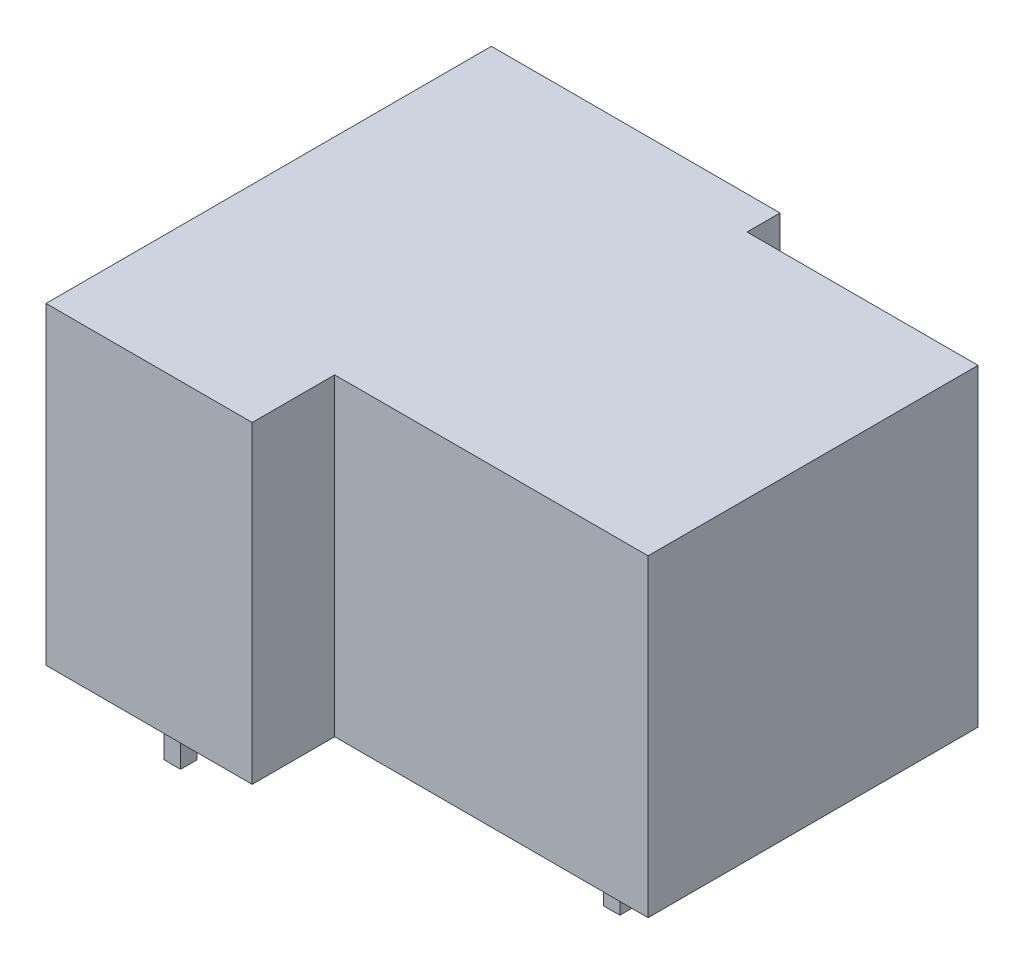
ISO-10303-21;
HEADER;
FILE_DESCRIPTION(('STEP AP214'),'2;1');
FILE_NAME('part.step','',(''),(''),'','','');
FILE_SCHEMA(('AUTOMOTIVE_DESIGN { 1 0 10303 214 1 1 1 1 }'));
ENDSEC;
DATA;
#1=APPLICATION_CONTEXT('core data for automotive mechanical design processes');
#2=APPLICATION_PROTOCOL_DEFINITION('international standard','automotive_design',2000,#1);
#3=PRODUCT_CONTEXT('',#1,'mechanical');
#4=PRODUCT('Part','Part','',(#3));
#5=PRODUCT_RELATED_PRODUCT_CATEGORY('part','',(#4));
#6=PRODUCT_DEFINITION_FORMATION('','',#4);
#7=PRODUCT_DEFINITION_CONTEXT('part definition',#1,'design');
#8=PRODUCT_DEFINITION('design','',#6,#7);
#9=PRODUCT_DEFINITION_SHAPE('','',#8);
#10=(LENGTH_UNIT() NAMED_UNIT(*) SI_UNIT(.MILLI.,.METRE.));
#11=(NAMED_UNIT(*) PLANE_ANGLE_UNIT() SI_UNIT($,.RADIAN.));
#12=(NAMED_UNIT(*) SI_UNIT($,.STERADIAN.) SOLID_ANGLE_UNIT());
#13=UNCERTAINTY_MEASURE_WITH_UNIT(LENGTH_MEASURE(1.E-05),#10,'distance_accuracy_value','');
#14=(GEOMETRIC_REPRESENTATION_CONTEXT(3) GLOBAL_UNCERTAINTY_ASSIGNED_CONTEXT((#13)) GLOBAL_UNIT_ASSIGNED_CONTEXT((#10,
#11,#12)) REPRESENTATION_CONTEXT('',''));
#15=CARTESIAN_POINT('',(0.,0.,0.));
#16=DIRECTION('',(0.,0.,1.));
#17=DIRECTION('',(1.,0.,0.));
#18=AXIS2_PLACEMENT_3D('',#15,#16,#17);
#19=CARTESIAN_POINT('',(5.,0.,-12.));
#20=DIRECTION('',(0.,1.,0.));
#21=DIRECTION('',(0.,0.,1.));
#22=AXIS2_PLACEMENT_3D('',#19,#20,#21);
#23=PLANE('',#22);
#24=DIRECTION('',(1.,0.,0.));
#25=VECTOR('',#24,1.);
#26=CARTESIAN_POINT('',(-0.789220796480683,0.,-9.77773978099936));
#27=LINE('',#26,#25);
#28=CARTESIAN_POINT('',(-1.78922079648068,0.,-9.77773978099936));
#29=VERTEX_POINT('',#28);
#30=CARTESIAN_POINT('',(-0.789220796480683,0.,-9.77773978099936));
#31=VERTEX_POINT('',#30);
#32=EDGE_CURVE('E241',#29,#31,#27,.T.);
#33=ORIENTED_EDGE('',*,*,#32,.F.);
#34=DIRECTION('',(0.,0.,-1.));
#35=VECTOR('',#34,1.);
#36=CARTESIAN_POINT('',(-1.78922079648068,0.,-9.77773978099936));
#37=LINE('',#36,#35);
#38=CARTESIAN_POINT('',(-1.78922079648068,0.,-8.77773978099936));
#39=VERTEX_POINT('',#38);
#40=EDGE_CURVE('E254',#39,#29,#37,.T.);
#41=ORIENTED_EDGE('',*,*,#40,.F.);
#42=DIRECTION('',(-1.,0.,0.));
#43=VECTOR('',#42,1.);
#44=CARTESIAN_POINT('',(-0.789220796480683,0.,-8.77773978099936));
#45=LINE('',#44,#43);
#46=CARTESIAN_POINT('',(-0.789220796480683,0.,-8.77773978099936));
#47=VERTEX_POINT('',#46);
#48=EDGE_CURVE('E263',#47,#39,#45,.T.);
#49=ORIENTED_EDGE('',*,*,#48,.F.);
#50=DIRECTION('',(0.,0.,1.));
#51=VECTOR('',#50,1.);
#52=CARTESIAN_POINT('',(-0.789220796480683,0.,-9.77773978099936));
#53=LINE('',#52,#51);
#54=EDGE_CURVE('E244',#31,#47,#53,.T.);
#55=ORIENTED_EDGE('',*,*,#54,.F.);
#56=EDGE_LOOP('',(#33,#41,#49,#55));
#57=FACE_BOUND('',#56,.T.);
#58=DIRECTION('',(0.,0.,1.));
#59=VECTOR('',#58,1.);
#60=CARTESIAN_POINT('',(14.5169439383121,0.,7.22643302070398));
#61=LINE('',#60,#59);
#62=CARTESIAN_POINT('',(14.5169439383121,0.,6.22643302070398));
#63=VERTEX_POINT('',#62);
#64=CARTESIAN_POINT('',(14.5169439383121,0.,7.22643302070398));
#65=VERTEX_POINT('',#64);
#66=EDGE_CURVE('E312',#63,#65,#61,.T.);
#67=ORIENTED_EDGE('',*,*,#66,.F.);
#68=DIRECTION('',(1.,0.,0.));
#69=VECTOR('',#68,1.);
#70=CARTESIAN_POINT('',(14.5169439383121,0.,6.22643302070398));
#71=LINE('',#70,#69);
#72=CARTESIAN_POINT('',(13.5169439383121,0.,6.22643302070398));
#73=VERTEX_POINT('',#72);
#74=EDGE_CURVE('E317',#73,#63,#71,.T.);
#75=ORIENTED_EDGE('',*,*,#74,.F.);
#76=DIRECTION('',(0.,0.,-1.));
#77=VECTOR('',#76,1.);
#78=CARTESIAN_POINT('',(13.5169439383121,0.,7.22643302070398));
#79=LINE('',#78,#77);
#80=CARTESIAN_POINT('',(13.5169439383121,0.,7.22643302070397));
#81=VERTEX_POINT('',#80);
#82=EDGE_CURVE('E329',#81,#73,#79,.T.);
#83=ORIENTED_EDGE('',*,*,#82,.F.);
#84=DIRECTION('',(-1.,0.,0.));
#85=VECTOR('',#84,1.);
#86=CARTESIAN_POINT('',(14.5169439383121,0.,7.22643302070398));
#87=LINE('',#86,#85);
#88=EDGE_CURVE('E326',#65,#81,#87,.T.);
#89=ORIENTED_EDGE('',*,*,#88,.F.);
#90=EDGE_LOOP('',(#67,#75,#83,#89));
#91=FACE_BOUND('',#90,.T.);
#92=DIRECTION('',(0.,0.,-1.));
#93=VECTOR('',#92,1.);
#94=CARTESIAN_POINT('',(5.,0.,-12.));
#95=LINE('',#94,#93);
#96=CARTESIAN_POINT('',(5.,0.,-10.));
#97=VERTEX_POINT('',#96);
#98=CARTESIAN_POINT('',(5.,0.,-12.));
#99=VERTEX_POINT('',#98);
#100=EDGE_CURVE('E378',#97,#99,#95,.T.);
#101=ORIENTED_EDGE('',*,*,#100,.F.);
#102=DIRECTION('',(-1.,0.,0.));
#103=VECTOR('',#102,1.);
#104=CARTESIAN_POINT('',(5.,0.,-10.));
#105=LINE('',#104,#103);
#106=CARTESIAN_POINT('',(19.,0.,-10.));
#107=VERTEX_POINT('',#106);
#108=EDGE_CURVE('E383',#107,#97,#105,.T.);
#109=ORIENTED_EDGE('',*,*,#108,.F.);
#110=DIRECTION('',(0.,0.,-1.));
#111=VECTOR('',#110,1.);
#112=CARTESIAN_POINT('',(19.,0.,-10.));
#113=LINE('',#112,#111);
#114=CARTESIAN_POINT('',(19.,0.,9.99999999999999));
#115=VERTEX_POINT('',#114);
#116=EDGE_CURVE('E410',#115,#107,#113,.T.);
#117=ORIENTED_EDGE('',*,*,#116,.F.);
#118=DIRECTION('',(1.,0.,0.));
#119=VECTOR('',#118,1.);
#120=CARTESIAN_POINT('',(0.,0.,10.));
#121=LINE('',#120,#119);
#122=CARTESIAN_POINT('',(0.,0.,10.));
#123=VERTEX_POINT('',#122);
#124=EDGE_CURVE('E408',#123,#115,#121,.T.);
#125=ORIENTED_EDGE('',*,*,#124,.F.);
#126=DIRECTION('',(0.,0.,-1.));
#127=VECTOR('',#126,1.);
#128=CARTESIAN_POINT('',(0.,0.,10.));
#129=LINE('',#128,#127);
#130=CARTESIAN_POINT('',(0.,0.,15.));
#131=VERTEX_POINT('',#130);
#132=EDGE_CURVE('E406',#131,#123,#129,.T.);
#133=ORIENTED_EDGE('',*,*,#132,.F.);
#134=DIRECTION('',(1.,0.,0.));
#135=VECTOR('',#134,1.);
#136=CARTESIAN_POINT('',(0.,0.,15.));
#137=LINE('',#136,#135);
#138=CARTESIAN_POINT('',(-12.5,0.,15.));
#139=VERTEX_POINT('',#138);
#140=EDGE_CURVE('E404',#139,#131,#137,.T.);
#141=ORIENTED_EDGE('',*,*,#140,.F.);
#142=DIRECTION('',(0.,0.,1.));
#143=VECTOR('',#142,1.);
#144=CARTESIAN_POINT('',(-12.5,0.,15.));
#145=LINE('',#144,#143);
#146=CARTESIAN_POINT('',(-12.5,0.,-12.));
#147=VERTEX_POINT('',#146);
#148=EDGE_CURVE('E402',#147,#139,#145,.T.);
#149=ORIENTED_EDGE('',*,*,#148,.F.);
#150=DIRECTION('',(-1.,0.,0.));
#151=VECTOR('',#150,1.);
#152=CARTESIAN_POINT('',(-12.5,0.,-12.));
#153=LINE('',#152,#151);
#154=EDGE_CURVE('E400',#99,#147,#153,.T.);
#155=ORIENTED_EDGE('',*,*,#154,.F.);
#156=EDGE_LOOP('',(#101,#109,#117,#125,#133,#141,#149,#155));
#157=FACE_BOUND('',#156,.T.);
#158=DIRECTION('',(0.,0.,1.));
#159=VECTOR('',#158,1.);
#160=CARTESIAN_POINT('',(14.3316033636376,0.,-8.52237654503826));
#161=LINE('',#160,#159);
#162=CARTESIAN_POINT('',(14.3316033636376,0.,-8.52237654503826));
#163=VERTEX_POINT('',#162);
#164=CARTESIAN_POINT('',(14.3316033636376,0.,-7.52237654503826));
#165=VERTEX_POINT('',#164);
#166=EDGE_CURVE('E345',#163,#165,#161,.T.);
#167=ORIENTED_EDGE('',*,*,#166,.F.);
#168=DIRECTION('',(1.,0.,0.));
#169=VECTOR('',#168,1.);
#170=CARTESIAN_POINT('',(14.3316033636376,0.,-8.52237654503826));
#171=LINE('',#170,#169);
#172=CARTESIAN_POINT('',(13.3316033636376,0.,-8.52237654503826));
#173=VERTEX_POINT('',#172);
#174=EDGE_CURVE('E350',#173,#163,#171,.T.);
#175=ORIENTED_EDGE('',*,*,#174,.F.);
#176=DIRECTION('',(0.,0.,-1.));
#177=VECTOR('',#176,1.);
#178=CARTESIAN_POINT('',(13.3316033636376,0.,-8.52237654503826));
#179=LINE('',#178,#177);
#180=CARTESIAN_POINT('',(13.3316033636376,0.,-7.52237654503826));
#181=VERTEX_POINT('',#180);
#182=EDGE_CURVE('E362',#181,#173,#179,.T.);
#183=ORIENTED_EDGE('',*,*,#182,.F.);
#184=DIRECTION('',(-1.,0.,0.));
#185=VECTOR('',#184,1.);
#186=CARTESIAN_POINT('',(14.3316033636376,0.,-7.52237654503826));
#187=LINE('',#186,#185);
#188=EDGE_CURVE('E359',#165,#181,#187,.T.);
#189=ORIENTED_EDGE('',*,*,#188,.F.);
#190=EDGE_LOOP('',(#167,#175,#183,#189));
#191=FACE_BOUND('',#190,.T.);
#192=DIRECTION('',(0.,0.,1.));
#193=VECTOR('',#192,1.);
#194=CARTESIAN_POINT('',(-6.45999999999999,0.,12.8823272481118));
#195=LINE('',#194,#193);
#196=CARTESIAN_POINT('',(-6.45999999999999,0.,11.8823272481118));
#197=VERTEX_POINT('',#196);
#198=CARTESIAN_POINT('',(-6.46,0.,12.8823272481118));
#199=VERTEX_POINT('',#198);
#200=EDGE_CURVE('E279',#197,#199,#195,.T.);
#201=ORIENTED_EDGE('',*,*,#200,.F.);
#202=DIRECTION('',(1.,0.,0.));
#203=VECTOR('',#202,1.);
#204=CARTESIAN_POINT('',(-6.45999999999999,0.,11.8823272481118));
#205=LINE('',#204,#203);
#206=CARTESIAN_POINT('',(-7.46,0.,11.8823272481118));
#207=VERTEX_POINT('',#206);
#208=EDGE_CURVE('E284',#207,#197,#205,.T.);
#209=ORIENTED_EDGE('',*,*,#208,.F.);
#210=DIRECTION('',(0.,0.,-1.));
#211=VECTOR('',#210,1.);
#212=CARTESIAN_POINT('',(-7.45999999999999,0.,12.8823272481118));
#213=LINE('',#212,#211);
#214=CARTESIAN_POINT('',(-7.45999999999999,0.,12.8823272481118));
#215=VERTEX_POINT('',#214);
#216=EDGE_CURVE('E296',#215,#207,#213,.T.);
#217=ORIENTED_EDGE('',*,*,#216,.F.);
#218=DIRECTION('',(-1.,0.,0.));
#219=VECTOR('',#218,1.);
#220=CARTESIAN_POINT('',(-6.45999999999999,0.,12.8823272481118));
#221=LINE('',#220,#219);
#222=EDGE_CURVE('E293',#199,#215,#221,.T.);
#223=ORIENTED_EDGE('',*,*,#222,.F.);
#224=EDGE_LOOP('',(#201,#209,#217,#223));
#225=FACE_BOUND('',#224,.T.);
#226=DIRECTION('',(1.,0.,0.));
#227=VECTOR('',#226,1.);
#228=CARTESIAN_POINT('',(-9.4593780681704,0.,-9.83861404506028));
#229=LINE('',#228,#227);
#230=CARTESIAN_POINT('',(-10.4593780681704,0.,-9.83861404506028));
#231=VERTEX_POINT('',#230);
#232=CARTESIAN_POINT('',(-9.4593780681704,0.,-9.83861404506028));
#233=VERTEX_POINT('',#232);
#234=EDGE_CURVE('E240',#231,#233,#229,.T.);
#235=ORIENTED_EDGE('',*,*,#234,.F.);
#236=DIRECTION('',(0.,0.,-1.));
#237=VECTOR('',#236,1.);
#238=CARTESIAN_POINT('',(-10.4593780681704,0.,-9.83861404506028));
#239=LINE('',#238,#237);
#240=CARTESIAN_POINT('',(-10.4593780681704,0.,-8.83861404506028));
#241=VERTEX_POINT('',#240);
#242=EDGE_CURVE('E237',#241,#231,#239,.T.);
#243=ORIENTED_EDGE('',*,*,#242,.F.);
#244=DIRECTION('',(-1.,0.,0.));
#245=VECTOR('',#244,1.);
#246=CARTESIAN_POINT('',(-9.4593780681704,0.,-8.83861404506028));
#247=LINE('',#246,#245);
#248=CARTESIAN_POINT('',(-9.4593780681704,0.,-8.83861404506028));
#249=VERTEX_POINT('',#248);
#250=EDGE_CURVE('E55',#249,#241,#247,.T.);
#251=ORIENTED_EDGE('',*,*,#250,.F.);
#252=DIRECTION('',(0.,0.,1.));
#253=VECTOR('',#252,1.);
#254=CARTESIAN_POINT('',(-9.4593780681704,0.,-9.83861404506028));
#255=LINE('',#254,#253);
#256=EDGE_CURVE('E50',#233,#249,#255,.T.);
#257=ORIENTED_EDGE('',*,*,#256,.F.);
#258=EDGE_LOOP('',(#235,#243,#251,#257));
#259=FACE_BOUND('',#258,.T.);
#260=ADVANCED_FACE('F35',(#57,#91,#157,#191,#225,#259),#23,.F.);
#261=CARTESIAN_POINT('',(5.,19.,-12.));
#262=DIRECTION('',(-1.,0.,0.));
#263=DIRECTION('',(0.,0.,1.));
#264=AXIS2_PLACEMENT_3D('',#261,#262,#263);
#265=PLANE('',#264);
#266=ORIENTED_EDGE('',*,*,#100,.T.);
#267=DIRECTION('',(0.,-1.,0.));
#268=VECTOR('',#267,1.);
#269=CARTESIAN_POINT('',(5.,19.,-12.));
#270=LINE('',#269,#268);
#271=CARTESIAN_POINT('',(5.,19.,-12.));
#272=VERTEX_POINT('',#271);
#273=EDGE_CURVE('E11',#272,#99,#270,.T.);
#274=ORIENTED_EDGE('',*,*,#273,.F.);
#275=DIRECTION('',(0.,0.,-1.));
#276=VECTOR('',#275,1.);
#277=CARTESIAN_POINT('',(5.,19.,-12.));
#278=LINE('',#277,#276);
#279=CARTESIAN_POINT('',(5.,19.,-10.));
#280=VERTEX_POINT('',#279);
#281=EDGE_CURVE('E379',#280,#272,#278,.T.);
#282=ORIENTED_EDGE('',*,*,#281,.F.);
#283=DIRECTION('',(0.,-1.,0.));
#284=VECTOR('',#283,1.);
#285=CARTESIAN_POINT('',(5.,19.,-10.));
#286=LINE('',#285,#284);
#287=EDGE_CURVE('E397',#280,#97,#286,.T.);
#288=ORIENTED_EDGE('',*,*,#287,.T.);
#289=EDGE_LOOP('',(#266,#274,#282,#288));
#290=FACE_BOUND('',#289,.T.);
#291=ADVANCED_FACE('F37',(#290),#265,.F.);
#292=CARTESIAN_POINT('',(-12.5,19.,-12.));
#293=DIRECTION('',(0.,0.,1.));
#294=DIRECTION('',(1.,0.,0.));
#295=AXIS2_PLACEMENT_3D('',#292,#293,#294);
#296=PLANE('',#295);
#297=ORIENTED_EDGE('',*,*,#154,.T.);
#298=DIRECTION('',(0.,-1.,0.));
#299=VECTOR('',#298,1.);
#300=CARTESIAN_POINT('',(-12.5,19.,-12.));
#301=LINE('',#300,#299);
#302=CARTESIAN_POINT('',(-12.5,19.,-12.));
#303=VERTEX_POINT('',#302);
#304=EDGE_CURVE('E43',#303,#147,#301,.T.);
#305=ORIENTED_EDGE('',*,*,#304,.F.);
#306=DIRECTION('',(-1.,0.,0.));
#307=VECTOR('',#306,1.);
#308=CARTESIAN_POINT('',(-12.5,19.,-12.));
#309=LINE('',#308,#307);
#310=EDGE_CURVE('E382',#272,#303,#309,.T.);
#311=ORIENTED_EDGE('',*,*,#310,.F.);
#312=ORIENTED_EDGE('',*,*,#273,.T.);
#313=EDGE_LOOP('',(#297,#305,#311,#312));
#314=FACE_BOUND('',#313,.T.);
#315=ADVANCED_FACE('F457',(#314),#296,.F.);
#316=CARTESIAN_POINT('',(-12.5,19.,15.));
#317=DIRECTION('',(1.,0.,0.));
#318=DIRECTION('',(0.,0.,-1.));
#319=AXIS2_PLACEMENT_3D('',#316,#317,#318);
#320=PLANE('',#319);
#321=ORIENTED_EDGE('',*,*,#148,.T.);
#322=DIRECTION('',(0.,-1.,0.));
#323=VECTOR('',#322,1.);
#324=CARTESIAN_POINT('',(-12.5,19.,15.));
#325=LINE('',#324,#323);
#326=CARTESIAN_POINT('',(-12.5,19.,15.));
#327=VERTEX_POINT('',#326);
#328=EDGE_CURVE('E427',#327,#139,#325,.T.);
#329=ORIENTED_EDGE('',*,*,#328,.F.);
#330=DIRECTION('',(0.,0.,1.));
#331=VECTOR('',#330,1.);
#332=CARTESIAN_POINT('',(-12.5,19.,15.));
#333=LINE('',#332,#331);
#334=EDGE_CURVE('E385',#303,#327,#333,.T.);
#335=ORIENTED_EDGE('',*,*,#334,.F.);
#336=ORIENTED_EDGE('',*,*,#304,.T.);
#337=EDGE_LOOP('',(#321,#329,#335,#336));
#338=FACE_BOUND('',#337,.T.);
#339=ADVANCED_FACE('F434',(#338),#320,.F.);
#340=CARTESIAN_POINT('',(0.,19.,15.));
#341=DIRECTION('',(0.,0.,-1.));
#342=DIRECTION('',(-1.,0.,0.));
#343=AXIS2_PLACEMENT_3D('',#340,#341,#342);
#344=PLANE('',#343);
#345=ORIENTED_EDGE('',*,*,#140,.T.);
#346=DIRECTION('',(0.,-1.,0.));
#347=VECTOR('',#346,1.);
#348=CARTESIAN_POINT('',(0.,19.,15.));
#349=LINE('',#348,#347);
#350=CARTESIAN_POINT('',(0.,19.,15.));
#351=VERTEX_POINT('',#350);
#352=EDGE_CURVE('E424',#351,#131,#349,.T.);
#353=ORIENTED_EDGE('',*,*,#352,.F.);
#354=DIRECTION('',(1.,0.,0.));
#355=VECTOR('',#354,1.);
#356=CARTESIAN_POINT('',(0.,19.,15.));
#357=LINE('',#356,#355);
#358=EDGE_CURVE('E387',#327,#351,#357,.T.);
#359=ORIENTED_EDGE('',*,*,#358,.F.);
#360=ORIENTED_EDGE('',*,*,#328,.T.);
#361=EDGE_LOOP('',(#345,#353,#359,#360));
#362=FACE_BOUND('',#361,.T.);
#363=ADVANCED_FACE('F445',(#362),#344,.F.);
#364=CARTESIAN_POINT('',(0.,19.,10.));
#365=DIRECTION('',(-1.,0.,0.));
#366=DIRECTION('',(0.,0.,1.));
#367=AXIS2_PLACEMENT_3D('',#364,#365,#366);
#368=PLANE('',#367);
#369=ORIENTED_EDGE('',*,*,#132,.T.);
#370=DIRECTION('',(0.,-1.,0.));
#371=VECTOR('',#370,1.);
#372=CARTESIAN_POINT('',(0.,19.,10.));
#373=LINE('',#372,#371);
#374=CARTESIAN_POINT('',(0.,19.,10.));
#375=VERTEX_POINT('',#374);
#376=EDGE_CURVE('E421',#375,#123,#373,.T.);
#377=ORIENTED_EDGE('',*,*,#376,.F.);
#378=DIRECTION('',(0.,0.,-1.));
#379=VECTOR('',#378,1.);
#380=CARTESIAN_POINT('',(0.,19.,10.));
#381=LINE('',#380,#379);
#382=EDGE_CURVE('E389',#351,#375,#381,.T.);
#383=ORIENTED_EDGE('',*,*,#382,.F.);
#384=ORIENTED_EDGE('',*,*,#352,.T.);
#385=EDGE_LOOP('',(#369,#377,#383,#384));
#386=FACE_BOUND('',#385,.T.);
#387=ADVANCED_FACE('F449',(#386),#368,.F.);
#388=CARTESIAN_POINT('',(0.,19.,10.));
#389=DIRECTION('',(0.,0.,-1.));
#390=DIRECTION('',(-1.,0.,0.));
#391=AXIS2_PLACEMENT_3D('',#388,#389,#390);
#392=PLANE('',#391);
#393=ORIENTED_EDGE('',*,*,#124,.T.);
#394=DIRECTION('',(0.,-1.,0.));
#395=VECTOR('',#394,1.);
#396=CARTESIAN_POINT('',(19.,19.,9.99999999999999));
#397=LINE('',#396,#395);
#398=CARTESIAN_POINT('',(19.,19.,9.99999999999999));
#399=VERTEX_POINT('',#398);
#400=EDGE_CURVE('E418',#399,#115,#397,.T.);
#401=ORIENTED_EDGE('',*,*,#400,.F.);
#402=DIRECTION('',(1.,0.,0.));
#403=VECTOR('',#402,1.);
#404=CARTESIAN_POINT('',(0.,19.,10.));
#405=LINE('',#404,#403);
#406=EDGE_CURVE('E391',#375,#399,#405,.T.);
#407=ORIENTED_EDGE('',*,*,#406,.F.);
#408=ORIENTED_EDGE('',*,*,#376,.T.);
#409=EDGE_LOOP('',(#393,#401,#407,#408));
#410=FACE_BOUND('',#409,.T.);
#411=ADVANCED_FACE('F470',(#410),#392,.F.);
#412=CARTESIAN_POINT('',(19.,19.,-10.));
#413=DIRECTION('',(-1.,0.,0.));
#414=DIRECTION('',(0.,0.,1.));
#415=AXIS2_PLACEMENT_3D('',#412,#413,#414);
#416=PLANE('',#415);
#417=ORIENTED_EDGE('',*,*,#116,.T.);
#418=DIRECTION('',(0.,-1.,0.));
#419=VECTOR('',#418,1.);
#420=CARTESIAN_POINT('',(19.,19.,-10.));
#421=LINE('',#420,#419);
#422=CARTESIAN_POINT('',(19.,19.,-10.));
#423=VERTEX_POINT('',#422);
#424=EDGE_CURVE('E415',#423,#107,#421,.T.);
#425=ORIENTED_EDGE('',*,*,#424,.F.);
#426=DIRECTION('',(0.,0.,-1.));
#427=VECTOR('',#426,1.);
#428=CARTESIAN_POINT('',(19.,19.,-10.));
#429=LINE('',#428,#427);
#430=EDGE_CURVE('E393',#399,#423,#429,.T.);
#431=ORIENTED_EDGE('',*,*,#430,.F.);
#432=ORIENTED_EDGE('',*,*,#400,.T.);
#433=EDGE_LOOP('',(#417,#425,#431,#432));
#434=FACE_BOUND('',#433,.T.);
#435=ADVANCED_FACE('F468',(#434),#416,.F.);
#436=CARTESIAN_POINT('',(5.,19.,-10.));
#437=DIRECTION('',(0.,0.,1.));
#438=DIRECTION('',(1.,0.,0.));
#439=AXIS2_PLACEMENT_3D('',#436,#437,#438);
#440=PLANE('',#439);
#441=ORIENTED_EDGE('',*,*,#108,.T.);
#442=ORIENTED_EDGE('',*,*,#287,.F.);
#443=DIRECTION('',(-1.,0.,0.));
#444=VECTOR('',#443,1.);
#445=CARTESIAN_POINT('',(5.,19.,-10.));
#446=LINE('',#445,#444);
#447=EDGE_CURVE('E395',#423,#280,#446,.T.);
#448=ORIENTED_EDGE('',*,*,#447,.F.);
#449=ORIENTED_EDGE('',*,*,#424,.T.);
#450=EDGE_LOOP('',(#441,#442,#448,#449));
#451=FACE_BOUND('',#450,.T.);
#452=ADVANCED_FACE('F463',(#451),#440,.F.);
#453=CARTESIAN_POINT('',(5.,19.,-12.));
#454=DIRECTION('',(0.,1.,0.));
#455=DIRECTION('',(0.,0.,1.));
#456=AXIS2_PLACEMENT_3D('',#453,#454,#455);
#457=PLANE('',#456);
#458=ORIENTED_EDGE('',*,*,#281,.T.);
#459=ORIENTED_EDGE('',*,*,#310,.T.);
#460=ORIENTED_EDGE('',*,*,#334,.T.);
#461=ORIENTED_EDGE('',*,*,#358,.T.);
#462=ORIENTED_EDGE('',*,*,#382,.T.);
#463=ORIENTED_EDGE('',*,*,#406,.T.);
#464=ORIENTED_EDGE('',*,*,#430,.T.);
#465=ORIENTED_EDGE('',*,*,#447,.T.);
#466=EDGE_LOOP('',(#458,#459,#460,#461,#462,#463,#464,#465));
#467=FACE_BOUND('',#466,.T.);
#468=ADVANCED_FACE('F453',(#467),#457,.T.);
#469=CARTESIAN_POINT('',(14.3316033636376,-3.5,-8.52237654503826));
#470=DIRECTION('',(-1.,0.,0.));
#471=DIRECTION('',(0.,0.,1.));
#472=AXIS2_PLACEMENT_3D('',#469,#470,#471);
#473=PLANE('',#472);
#474=ORIENTED_EDGE('',*,*,#166,.T.);
#475=DIRECTION('',(0.,1.,0.));
#476=VECTOR('',#475,1.);
#477=CARTESIAN_POINT('',(14.3316033636376,-3.5,-7.52237654503826));
#478=LINE('',#477,#476);
#479=CARTESIAN_POINT('',(14.3316033636376,-3.5,-7.52237654503826));
#480=VERTEX_POINT('',#479);
#481=EDGE_CURVE('E375',#480,#165,#478,.T.);
#482=ORIENTED_EDGE('',*,*,#481,.F.);
#483=DIRECTION('',(0.,0.,1.));
#484=VECTOR('',#483,1.);
#485=CARTESIAN_POINT('',(14.3316033636376,-3.5,-8.52237654503826));
#486=LINE('',#485,#484);
#487=CARTESIAN_POINT('',(14.3316033636376,-3.5,-8.52237654503826));
#488=VERTEX_POINT('',#487);
#489=EDGE_CURVE('E346',#488,#480,#486,.T.);
#490=ORIENTED_EDGE('',*,*,#489,.F.);
#491=DIRECTION('',(0.,1.,0.));
#492=VECTOR('',#491,1.);
#493=CARTESIAN_POINT('',(14.3316033636376,-3.5,-8.52237654503826));
#494=LINE('',#493,#492);
#495=EDGE_CURVE('E356',#488,#163,#494,.T.);
#496=ORIENTED_EDGE('',*,*,#495,.T.);
#497=EDGE_LOOP('',(#474,#482,#490,#496));
#498=FACE_BOUND('',#497,.T.);
#499=ADVANCED_FACE('F493',(#498),#473,.F.);
#500=CARTESIAN_POINT('',(14.3316033636376,-3.5,-7.52237654503826));
#501=DIRECTION('',(0.,0.,-1.));
#502=DIRECTION('',(-1.,0.,0.));
#503=AXIS2_PLACEMENT_3D('',#500,#501,#502);
#504=PLANE('',#503);
#505=ORIENTED_EDGE('',*,*,#188,.T.);
#506=DIRECTION('',(0.,1.,0.));
#507=VECTOR('',#506,1.);
#508=CARTESIAN_POINT('',(13.3316033636376,-3.5,-7.52237654503826));
#509=LINE('',#508,#507);
#510=CARTESIAN_POINT('',(13.3316033636376,-3.5,-7.52237654503826));
#511=VERTEX_POINT('',#510);
#512=EDGE_CURVE('E372',#511,#181,#509,.T.);
#513=ORIENTED_EDGE('',*,*,#512,.F.);
#514=DIRECTION('',(-1.,0.,0.));
#515=VECTOR('',#514,1.);
#516=CARTESIAN_POINT('',(14.3316033636376,-3.5,-7.52237654503826));
#517=LINE('',#516,#515);
#518=EDGE_CURVE('E349',#480,#511,#517,.T.);
#519=ORIENTED_EDGE('',*,*,#518,.F.);
#520=ORIENTED_EDGE('',*,*,#481,.T.);
#521=EDGE_LOOP('',(#505,#513,#519,#520));
#522=FACE_BOUND('',#521,.T.);
#523=ADVANCED_FACE('F497',(#522),#504,.F.);
#524=CARTESIAN_POINT('',(13.3316033636376,-3.5,-8.52237654503826));
#525=DIRECTION('',(1.,0.,0.));
#526=DIRECTION('',(0.,0.,-1.));
#527=AXIS2_PLACEMENT_3D('',#524,#525,#526);
#528=PLANE('',#527);
#529=ORIENTED_EDGE('',*,*,#182,.T.);
#530=DIRECTION('',(0.,1.,0.));
#531=VECTOR('',#530,1.);
#532=CARTESIAN_POINT('',(13.3316033636376,-3.5,-8.52237654503826));
#533=LINE('',#532,#531);
#534=CARTESIAN_POINT('',(13.3316033636376,-3.5,-8.52237654503826));
#535=VERTEX_POINT('',#534);
#536=EDGE_CURVE('E369',#535,#173,#533,.T.);
#537=ORIENTED_EDGE('',*,*,#536,.F.);
#538=DIRECTION('',(0.,0.,-1.));
#539=VECTOR('',#538,1.);
#540=CARTESIAN_POINT('',(13.3316033636376,-3.5,-8.52237654503826));
#541=LINE('',#540,#539);
#542=EDGE_CURVE('E352',#511,#535,#541,.T.);
#543=ORIENTED_EDGE('',*,*,#542,.F.);
#544=ORIENTED_EDGE('',*,*,#512,.T.);
#545=EDGE_LOOP('',(#529,#537,#543,#544));
#546=FACE_BOUND('',#545,.T.);
#547=ADVANCED_FACE('F502',(#546),#528,.F.);
#548=CARTESIAN_POINT('',(14.3316033636376,-3.5,-8.52237654503826));
#549=DIRECTION('',(0.,0.,1.));
#550=DIRECTION('',(1.,0.,0.));
#551=AXIS2_PLACEMENT_3D('',#548,#549,#550);
#552=PLANE('',#551);
#553=ORIENTED_EDGE('',*,*,#174,.T.);
#554=ORIENTED_EDGE('',*,*,#495,.F.);
#555=DIRECTION('',(1.,0.,0.));
#556=VECTOR('',#555,1.);
#557=CARTESIAN_POINT('',(14.3316033636376,-3.5,-8.52237654503826));
#558=LINE('',#557,#556);
#559=EDGE_CURVE('E354',#535,#488,#558,.T.);
#560=ORIENTED_EDGE('',*,*,#559,.F.);
#561=ORIENTED_EDGE('',*,*,#536,.T.);
#562=EDGE_LOOP('',(#553,#554,#560,#561));
#563=FACE_BOUND('',#562,.T.);
#564=ADVANCED_FACE('F508',(#563),#552,.F.);
#565=CARTESIAN_POINT('',(14.3316033636376,-3.5,-7.52237654503826));
#566=DIRECTION('',(0.,-1.,0.));
#567=DIRECTION('',(0.,0.,-1.));
#568=AXIS2_PLACEMENT_3D('',#565,#566,#567);
#569=PLANE('',#568);
#570=ORIENTED_EDGE('',*,*,#489,.T.);
#571=ORIENTED_EDGE('',*,*,#518,.T.);
#572=ORIENTED_EDGE('',*,*,#542,.T.);
#573=ORIENTED_EDGE('',*,*,#559,.T.);
#574=EDGE_LOOP('',(#570,#571,#572,#573));
#575=FACE_BOUND('',#574,.T.);
#576=ADVANCED_FACE('F512',(#575),#569,.T.);
#577=CARTESIAN_POINT('',(14.5169439383121,-3.5,7.22643302070398));
#578=DIRECTION('',(-1.,0.,0.));
#579=DIRECTION('',(0.,0.,1.));
#580=AXIS2_PLACEMENT_3D('',#577,#578,#579);
#581=PLANE('',#580);
#582=ORIENTED_EDGE('',*,*,#66,.T.);
#583=DIRECTION('',(0.,1.,0.));
#584=VECTOR('',#583,1.);
#585=CARTESIAN_POINT('',(14.5169439383121,-3.5,7.22643302070398));
#586=LINE('',#585,#584);
#587=CARTESIAN_POINT('',(14.5169439383121,-3.5,7.22643302070398));
#588=VERTEX_POINT('',#587);
#589=EDGE_CURVE('E342',#588,#65,#586,.T.);
#590=ORIENTED_EDGE('',*,*,#589,.F.);
#591=DIRECTION('',(0.,0.,1.));
#592=VECTOR('',#591,1.);
#593=CARTESIAN_POINT('',(14.5169439383121,-3.5,7.22643302070398));
#594=LINE('',#593,#592);
#595=CARTESIAN_POINT('',(14.5169439383121,-3.5,6.22643302070398));
#596=VERTEX_POINT('',#595);
#597=EDGE_CURVE('E313',#596,#588,#594,.T.);
#598=ORIENTED_EDGE('',*,*,#597,.F.);
#599=DIRECTION('',(0.,1.,0.));
#600=VECTOR('',#599,1.);
#601=CARTESIAN_POINT('',(14.5169439383121,-3.5,6.22643302070398));
#602=LINE('',#601,#600);
#603=EDGE_CURVE('E323',#596,#63,#602,.T.);
#604=ORIENTED_EDGE('',*,*,#603,.T.);
#605=EDGE_LOOP('',(#582,#590,#598,#604));
#606=FACE_BOUND('',#605,.T.);
#607=ADVANCED_FACE('F516',(#606),#581,.F.);
#608=CARTESIAN_POINT('',(14.5169439383121,-3.5,7.22643302070398));
#609=DIRECTION('',(0.,0.,-1.));
#610=DIRECTION('',(-1.,0.,0.));
#611=AXIS2_PLACEMENT_3D('',#608,#609,#610);
#612=PLANE('',#611);
#613=ORIENTED_EDGE('',*,*,#88,.T.);
#614=DIRECTION('',(0.,1.,0.));
#615=VECTOR('',#614,1.);
#616=CARTESIAN_POINT('',(13.5169439383121,-3.5,7.22643302070398));
#617=LINE('',#616,#615);
#618=CARTESIAN_POINT('',(13.5169439383121,-3.5,7.22643302070398));
#619=VERTEX_POINT('',#618);
#620=EDGE_CURVE('E339',#619,#81,#617,.T.);
#621=ORIENTED_EDGE('',*,*,#620,.F.);
#622=DIRECTION('',(-1.,0.,0.));
#623=VECTOR('',#622,1.);
#624=CARTESIAN_POINT('',(14.5169439383121,-3.5,7.22643302070398));
#625=LINE('',#624,#623);
#626=EDGE_CURVE('E316',#588,#619,#625,.T.);
#627=ORIENTED_EDGE('',*,*,#626,.F.);
#628=ORIENTED_EDGE('',*,*,#589,.T.);
#629=EDGE_LOOP('',(#613,#621,#627,#628));
#630=FACE_BOUND('',#629,.T.);
#631=ADVANCED_FACE('F520',(#630),#612,.F.);
#632=CARTESIAN_POINT('',(13.5169439383121,-3.5,7.22643302070398));
#633=DIRECTION('',(1.,0.,0.));
#634=DIRECTION('',(0.,0.,-1.));
#635=AXIS2_PLACEMENT_3D('',#632,#633,#634);
#636=PLANE('',#635);
#637=ORIENTED_EDGE('',*,*,#82,.T.);
#638=DIRECTION('',(0.,1.,0.));
#639=VECTOR('',#638,1.);
#640=CARTESIAN_POINT('',(13.5169439383121,-3.5,6.22643302070398));
#641=LINE('',#640,#639);
#642=CARTESIAN_POINT('',(13.5169439383121,-3.5,6.22643302070398));
#643=VERTEX_POINT('',#642);
#644=EDGE_CURVE('E336',#643,#73,#641,.T.);
#645=ORIENTED_EDGE('',*,*,#644,.F.);
#646=DIRECTION('',(0.,0.,-1.));
#647=VECTOR('',#646,1.);
#648=CARTESIAN_POINT('',(13.5169439383121,-3.5,7.22643302070398));
#649=LINE('',#648,#647);
#650=EDGE_CURVE('E319',#619,#643,#649,.T.);
#651=ORIENTED_EDGE('',*,*,#650,.F.);
#652=ORIENTED_EDGE('',*,*,#620,.T.);
#653=EDGE_LOOP('',(#637,#645,#651,#652));
#654=FACE_BOUND('',#653,.T.);
#655=ADVANCED_FACE('F524',(#654),#636,.F.);
#656=CARTESIAN_POINT('',(14.5169439383121,-3.5,6.22643302070398));
#657=DIRECTION('',(0.,0.,1.));
#658=DIRECTION('',(1.,0.,0.));
#659=AXIS2_PLACEMENT_3D('',#656,#657,#658);
#660=PLANE('',#659);
#661=ORIENTED_EDGE('',*,*,#74,.T.);
#662=ORIENTED_EDGE('',*,*,#603,.F.);
#663=DIRECTION('',(1.,0.,0.));
#664=VECTOR('',#663,1.);
#665=CARTESIAN_POINT('',(14.5169439383121,-3.5,6.22643302070398));
#666=LINE('',#665,#664);
#667=EDGE_CURVE('E321',#643,#596,#666,.T.);
#668=ORIENTED_EDGE('',*,*,#667,.F.);
#669=ORIENTED_EDGE('',*,*,#644,.T.);
#670=EDGE_LOOP('',(#661,#662,#668,#669));
#671=FACE_BOUND('',#670,.T.);
#672=ADVANCED_FACE('F528',(#671),#660,.F.);
#673=CARTESIAN_POINT('',(14.5169439383121,-3.5,7.22643302070398));
#674=DIRECTION('',(0.,1.,0.));
#675=DIRECTION('',(0.,0.,1.));
#676=AXIS2_PLACEMENT_3D('',#673,#674,#675);
#677=PLANE('',#676);
#678=ORIENTED_EDGE('',*,*,#597,.T.);
#679=ORIENTED_EDGE('',*,*,#626,.T.);
#680=ORIENTED_EDGE('',*,*,#650,.T.);
#681=ORIENTED_EDGE('',*,*,#667,.T.);
#682=EDGE_LOOP('',(#678,#679,#680,#681));
#683=FACE_BOUND('',#682,.T.);
#684=ADVANCED_FACE('F532',(#683),#677,.F.);
#685=CARTESIAN_POINT('',(-6.45999999999999,-3.5,12.8823272481118));
#686=DIRECTION('',(-1.,0.,0.));
#687=DIRECTION('',(0.,0.,1.));
#688=AXIS2_PLACEMENT_3D('',#685,#686,#687);
#689=PLANE('',#688);
#690=ORIENTED_EDGE('',*,*,#200,.T.);
#691=DIRECTION('',(0.,1.,0.));
#692=VECTOR('',#691,1.);
#693=CARTESIAN_POINT('',(-6.45999999999999,-3.5,12.8823272481118));
#694=LINE('',#693,#692);
#695=CARTESIAN_POINT('',(-6.45999999999999,-3.5,12.8823272481118));
#696=VERTEX_POINT('',#695);
#697=EDGE_CURVE('E309',#696,#199,#694,.T.);
#698=ORIENTED_EDGE('',*,*,#697,.F.);
#699=DIRECTION('',(0.,0.,1.));
#700=VECTOR('',#699,1.);
#701=CARTESIAN_POINT('',(-6.45999999999999,-3.5,12.8823272481118));
#702=LINE('',#701,#700);
#703=CARTESIAN_POINT('',(-6.45999999999999,-3.5,11.8823272481118));
#704=VERTEX_POINT('',#703);
#705=EDGE_CURVE('E280',#704,#696,#702,.T.);
#706=ORIENTED_EDGE('',*,*,#705,.F.);
#707=DIRECTION('',(0.,1.,0.));
#708=VECTOR('',#707,1.);
#709=CARTESIAN_POINT('',(-6.45999999999999,-3.5,11.8823272481118));
#710=LINE('',#709,#708);
#711=EDGE_CURVE('E290',#704,#197,#710,.T.);
#712=ORIENTED_EDGE('',*,*,#711,.T.);
#713=EDGE_LOOP('',(#690,#698,#706,#712));
#714=FACE_BOUND('',#713,.T.);
#715=ADVANCED_FACE('F536',(#714),#689,.F.);
#716=CARTESIAN_POINT('',(-6.45999999999999,-3.5,12.8823272481118));
#717=DIRECTION('',(0.,0.,-1.));
#718=DIRECTION('',(-1.,0.,0.));
#719=AXIS2_PLACEMENT_3D('',#716,#717,#718);
#720=PLANE('',#719);
#721=ORIENTED_EDGE('',*,*,#222,.T.);
#722=DIRECTION('',(0.,1.,0.));
#723=VECTOR('',#722,1.);
#724=CARTESIAN_POINT('',(-7.45999999999999,-3.5,12.8823272481118));
#725=LINE('',#724,#723);
#726=CARTESIAN_POINT('',(-7.45999999999999,-3.5,12.8823272481118));
#727=VERTEX_POINT('',#726);
#728=EDGE_CURVE('E306',#727,#215,#725,.T.);
#729=ORIENTED_EDGE('',*,*,#728,.F.);
#730=DIRECTION('',(-1.,0.,0.));
#731=VECTOR('',#730,1.);
#732=CARTESIAN_POINT('',(-6.45999999999999,-3.5,12.8823272481118));
#733=LINE('',#732,#731);
#734=EDGE_CURVE('E283',#696,#727,#733,.T.);
#735=ORIENTED_EDGE('',*,*,#734,.F.);
#736=ORIENTED_EDGE('',*,*,#697,.T.);
#737=EDGE_LOOP('',(#721,#729,#735,#736));
#738=FACE_BOUND('',#737,.T.);
#739=ADVANCED_FACE('F540',(#738),#720,.F.);
#740=CARTESIAN_POINT('',(-7.45999999999999,-3.5,12.8823272481118));
#741=DIRECTION('',(1.,0.,0.));
#742=DIRECTION('',(0.,0.,-1.));
#743=AXIS2_PLACEMENT_3D('',#740,#741,#742);
#744=PLANE('',#743);
#745=ORIENTED_EDGE('',*,*,#216,.T.);
#746=DIRECTION('',(0.,1.,0.));
#747=VECTOR('',#746,1.);
#748=CARTESIAN_POINT('',(-7.46,-3.5,11.8823272481118));
#749=LINE('',#748,#747);
#750=CARTESIAN_POINT('',(-7.46,-3.5,11.8823272481118));
#751=VERTEX_POINT('',#750);
#752=EDGE_CURVE('E303',#751,#207,#749,.T.);
#753=ORIENTED_EDGE('',*,*,#752,.F.);
#754=DIRECTION('',(0.,0.,-1.));
#755=VECTOR('',#754,1.);
#756=CARTESIAN_POINT('',(-7.45999999999999,-3.5,12.8823272481118));
#757=LINE('',#756,#755);
#758=EDGE_CURVE('E286',#727,#751,#757,.T.);
#759=ORIENTED_EDGE('',*,*,#758,.F.);
#760=ORIENTED_EDGE('',*,*,#728,.T.);
#761=EDGE_LOOP('',(#745,#753,#759,#760));
#762=FACE_BOUND('',#761,.T.);
#763=ADVANCED_FACE('F544',(#762),#744,.F.);
#764=CARTESIAN_POINT('',(-6.45999999999999,-3.5,11.8823272481118));
#765=DIRECTION('',(0.,0.,1.));
#766=DIRECTION('',(1.,0.,0.));
#767=AXIS2_PLACEMENT_3D('',#764,#765,#766);
#768=PLANE('',#767);
#769=ORIENTED_EDGE('',*,*,#208,.T.);
#770=ORIENTED_EDGE('',*,*,#711,.F.);
#771=DIRECTION('',(1.,0.,0.));
#772=VECTOR('',#771,1.);
#773=CARTESIAN_POINT('',(-6.45999999999999,-3.5,11.8823272481118));
#774=LINE('',#773,#772);
#775=EDGE_CURVE('E288',#751,#704,#774,.T.);
#776=ORIENTED_EDGE('',*,*,#775,.F.);
#777=ORIENTED_EDGE('',*,*,#752,.T.);
#778=EDGE_LOOP('',(#769,#770,#776,#777));
#779=FACE_BOUND('',#778,.T.);
#780=ADVANCED_FACE('F548',(#779),#768,.F.);
#781=CARTESIAN_POINT('',(-6.45999999999999,-3.5,11.8823272481118));
#782=DIRECTION('',(0.,1.,0.));
#783=DIRECTION('',(0.,0.,1.));
#784=AXIS2_PLACEMENT_3D('',#781,#782,#783);
#785=PLANE('',#784);
#786=ORIENTED_EDGE('',*,*,#705,.T.);
#787=ORIENTED_EDGE('',*,*,#734,.T.);
#788=ORIENTED_EDGE('',*,*,#758,.T.);
#789=ORIENTED_EDGE('',*,*,#775,.T.);
#790=EDGE_LOOP('',(#786,#787,#788,#789));
#791=FACE_BOUND('',#790,.T.);
#792=ADVANCED_FACE('F552',(#791),#785,.F.);
#793=CARTESIAN_POINT('',(-0.789220796480683,-3.5,-9.77773978099936));
#794=DIRECTION('',(0.,0.,1.));
#795=DIRECTION('',(1.,0.,0.));
#796=AXIS2_PLACEMENT_3D('',#793,#794,#795);
#797=PLANE('',#796);
#798=ORIENTED_EDGE('',*,*,#32,.T.);
#799=DIRECTION('',(0.,1.,0.));
#800=VECTOR('',#799,1.);
#801=CARTESIAN_POINT('',(-0.789220796480683,-3.5,-9.77773978099936));
#802=LINE('',#801,#800);
#803=CARTESIAN_POINT('',(-0.789220796480683,-3.5,-9.77773978099936));
#804=VERTEX_POINT('',#803);
#805=EDGE_CURVE('E276',#804,#31,#802,.T.);
#806=ORIENTED_EDGE('',*,*,#805,.F.);
#807=DIRECTION('',(1.,0.,0.));
#808=VECTOR('',#807,1.);
#809=CARTESIAN_POINT('',(-0.789220796480683,-3.5,-9.77773978099936));
#810=LINE('',#809,#808);
#811=CARTESIAN_POINT('',(-1.78922079648068,-3.5,-9.77773978099936));
#812=VERTEX_POINT('',#811);
#813=EDGE_CURVE('E250',#812,#804,#810,.T.);
#814=ORIENTED_EDGE('',*,*,#813,.F.);
#815=DIRECTION('',(0.,1.,0.));
#816=VECTOR('',#815,1.);
#817=CARTESIAN_POINT('',(-1.78922079648068,-3.5,-9.77773978099936));
#818=LINE('',#817,#816);
#819=EDGE_CURVE('E259',#812,#29,#818,.T.);
#820=ORIENTED_EDGE('',*,*,#819,.T.);
#821=EDGE_LOOP('',(#798,#806,#814,#820));
#822=FACE_BOUND('',#821,.T.);
#823=ADVANCED_FACE('F556',(#822),#797,.F.);
#824=CARTESIAN_POINT('',(-0.789220796480683,-3.5,-9.77773978099936));
#825=DIRECTION('',(-1.,0.,0.));
#826=DIRECTION('',(0.,0.,1.));
#827=AXIS2_PLACEMENT_3D('',#824,#825,#826);
#828=PLANE('',#827);
#829=ORIENTED_EDGE('',*,*,#54,.T.);
#830=DIRECTION('',(0.,1.,0.));
#831=VECTOR('',#830,1.);
#832=CARTESIAN_POINT('',(-0.789220796480683,-3.5,-8.77773978099936));
#833=LINE('',#832,#831);
#834=CARTESIAN_POINT('',(-0.789220796480683,-3.5,-8.77773978099936));
#835=VERTEX_POINT('',#834);
#836=EDGE_CURVE('E273',#835,#47,#833,.T.);
#837=ORIENTED_EDGE('',*,*,#836,.F.);
#838=DIRECTION('',(0.,0.,1.));
#839=VECTOR('',#838,1.);
#840=CARTESIAN_POINT('',(-0.789220796480683,-3.5,-9.77773978099936));
#841=LINE('',#840,#839);
#842=EDGE_CURVE('E253',#804,#835,#841,.T.);
#843=ORIENTED_EDGE('',*,*,#842,.F.);
#844=ORIENTED_EDGE('',*,*,#805,.T.);
#845=EDGE_LOOP('',(#829,#837,#843,#844));
#846=FACE_BOUND('',#845,.T.);
#847=ADVANCED_FACE('F560',(#846),#828,.F.);
#848=CARTESIAN_POINT('',(-0.789220796480683,-3.5,-8.77773978099936));
#849=DIRECTION('',(0.,0.,-1.));
#850=DIRECTION('',(-1.,0.,0.));
#851=AXIS2_PLACEMENT_3D('',#848,#849,#850);
#852=PLANE('',#851);
#853=ORIENTED_EDGE('',*,*,#48,.T.);
#854=DIRECTION('',(0.,1.,0.));
#855=VECTOR('',#854,1.);
#856=CARTESIAN_POINT('',(-1.78922079648068,-3.5,-8.77773978099936));
#857=LINE('',#856,#855);
#858=CARTESIAN_POINT('',(-1.78922079648068,-3.5,-8.77773978099936));
#859=VERTEX_POINT('',#858);
#860=EDGE_CURVE('E270',#859,#39,#857,.T.);
#861=ORIENTED_EDGE('',*,*,#860,.F.);
#862=DIRECTION('',(-1.,0.,0.));
#863=VECTOR('',#862,1.);
#864=CARTESIAN_POINT('',(-0.789220796480683,-3.5,-8.77773978099936));
#865=LINE('',#864,#863);
#866=EDGE_CURVE('E256',#835,#859,#865,.T.);
#867=ORIENTED_EDGE('',*,*,#866,.F.);
#868=ORIENTED_EDGE('',*,*,#836,.T.);
#869=EDGE_LOOP('',(#853,#861,#867,#868));
#870=FACE_BOUND('',#869,.T.);
#871=ADVANCED_FACE('F564',(#870),#852,.F.);
#872=CARTESIAN_POINT('',(-1.78922079648068,-3.5,-9.77773978099936));
#873=DIRECTION('',(1.,0.,0.));
#874=DIRECTION('',(0.,0.,-1.));
#875=AXIS2_PLACEMENT_3D('',#872,#873,#874);
#876=PLANE('',#875);
#877=ORIENTED_EDGE('',*,*,#40,.T.);
#878=ORIENTED_EDGE('',*,*,#819,.F.);
#879=DIRECTION('',(0.,0.,-1.));
#880=VECTOR('',#879,1.);
#881=CARTESIAN_POINT('',(-1.78922079648068,-3.5,-9.77773978099936));
#882=LINE('',#881,#880);
#883=EDGE_CURVE('E258',#859,#812,#882,.T.);
#884=ORIENTED_EDGE('',*,*,#883,.F.);
#885=ORIENTED_EDGE('',*,*,#860,.T.);
#886=EDGE_LOOP('',(#877,#878,#884,#885));
#887=FACE_BOUND('',#886,.T.);
#888=ADVANCED_FACE('F568',(#887),#876,.F.);
#889=CARTESIAN_POINT('',(-1.78922079648068,-3.5,-9.77773978099936));
#890=DIRECTION('',(0.,1.,0.));
#891=DIRECTION('',(0.,0.,1.));
#892=AXIS2_PLACEMENT_3D('',#889,#890,#891);
#893=PLANE('',#892);
#894=ORIENTED_EDGE('',*,*,#813,.T.);
#895=ORIENTED_EDGE('',*,*,#842,.T.);
#896=ORIENTED_EDGE('',*,*,#866,.T.);
#897=ORIENTED_EDGE('',*,*,#883,.T.);
#898=EDGE_LOOP('',(#894,#895,#896,#897));
#899=FACE_BOUND('',#898,.T.);
#900=ADVANCED_FACE('F572',(#899),#893,.F.);
#901=CARTESIAN_POINT('',(-9.4593780681704,-3.5,-9.83861404506028));
#902=DIRECTION('',(0.,0.,1.));
#903=DIRECTION('',(1.,0.,0.));
#904=AXIS2_PLACEMENT_3D('',#901,#902,#903);
#905=PLANE('',#904);
#906=ORIENTED_EDGE('',*,*,#234,.T.);
#907=DIRECTION('',(0.,1.,0.));
#908=VECTOR('',#907,1.);
#909=CARTESIAN_POINT('',(-9.4593780681704,-3.5,-9.83861404506028));
#910=LINE('',#909,#908);
#911=CARTESIAN_POINT('',(-9.4593780681704,-3.5,-9.83861404506028));
#912=VERTEX_POINT('',#911);
#913=EDGE_CURVE('E221',#912,#233,#910,.T.);
#914=ORIENTED_EDGE('',*,*,#913,.F.);
#915=DIRECTION('',(1.,0.,0.));
#916=VECTOR('',#915,1.);
#917=CARTESIAN_POINT('',(-9.4593780681704,-3.5,-9.83861404506028));
#918=LINE('',#917,#916);
#919=CARTESIAN_POINT('',(-10.4593780681704,-3.5,-9.83861404506028));
#920=VERTEX_POINT('',#919);
#921=EDGE_CURVE('E228',#920,#912,#918,.T.);
#922=ORIENTED_EDGE('',*,*,#921,.F.);
#923=DIRECTION('',(0.,1.,0.));
#924=VECTOR('',#923,1.);
#925=CARTESIAN_POINT('',(-10.4593780681704,-3.5,-9.83861404506028));
#926=LINE('',#925,#924);
#927=EDGE_CURVE('E797',#920,#231,#926,.T.);
#928=ORIENTED_EDGE('',*,*,#927,.T.);
#929=EDGE_LOOP('',(#906,#914,#922,#928));
#930=FACE_BOUND('',#929,.T.);
#931=ADVANCED_FACE('F239',(#930),#905,.F.);
#932=CARTESIAN_POINT('',(-9.4593780681704,-3.5,-9.83861404506028));
#933=DIRECTION('',(-1.,0.,0.));
#934=DIRECTION('',(0.,0.,1.));
#935=AXIS2_PLACEMENT_3D('',#932,#933,#934);
#936=PLANE('',#935);
#937=ORIENTED_EDGE('',*,*,#256,.T.);
#938=DIRECTION('',(0.,1.,0.));
#939=VECTOR('',#938,1.);
#940=CARTESIAN_POINT('',(-9.4593780681704,-3.5,-8.83861404506028));
#941=LINE('',#940,#939);
#942=CARTESIAN_POINT('',(-9.4593780681704,-3.5,-8.83861404506028));
#943=VERTEX_POINT('',#942);
#944=EDGE_CURVE('E224',#943,#249,#941,.T.);
#945=ORIENTED_EDGE('',*,*,#944,.F.);
#946=DIRECTION('',(0.,0.,1.));
#947=VECTOR('',#946,1.);
#948=CARTESIAN_POINT('',(-9.4593780681704,-3.5,-9.83861404506028));
#949=LINE('',#948,#947);
#950=EDGE_CURVE('E217',#912,#943,#949,.T.);
#951=ORIENTED_EDGE('',*,*,#950,.F.);
#952=ORIENTED_EDGE('',*,*,#913,.T.);
#953=EDGE_LOOP('',(#937,#945,#951,#952));
#954=FACE_BOUND('',#953,.T.);
#955=ADVANCED_FACE('F219',(#954),#936,.F.);
#956=CARTESIAN_POINT('',(-9.4593780681704,-3.5,-8.83861404506028));
#957=DIRECTION('',(0.,0.,-1.));
#958=DIRECTION('',(-1.,0.,0.));
#959=AXIS2_PLACEMENT_3D('',#956,#957,#958);
#960=PLANE('',#959);
#961=ORIENTED_EDGE('',*,*,#250,.T.);
#962=DIRECTION('',(0.,1.,0.));
#963=VECTOR('',#962,1.);
#964=CARTESIAN_POINT('',(-10.4593780681704,-3.5,-8.83861404506028));
#965=LINE('',#964,#963);
#966=CARTESIAN_POINT('',(-10.4593780681704,-3.5,-8.83861404506028));
#967=VERTEX_POINT('',#966);
#968=EDGE_CURVE('E246',#967,#241,#965,.T.);
#969=ORIENTED_EDGE('',*,*,#968,.F.);
#970=DIRECTION('',(-1.,0.,0.));
#971=VECTOR('',#970,1.);
#972=CARTESIAN_POINT('',(-9.4593780681704,-3.5,-8.83861404506028));
#973=LINE('',#972,#971);
#974=EDGE_CURVE('E227',#943,#967,#973,.T.);
#975=ORIENTED_EDGE('',*,*,#974,.F.);
#976=ORIENTED_EDGE('',*,*,#944,.T.);
#977=EDGE_LOOP('',(#961,#969,#975,#976));
#978=FACE_BOUND('',#977,.T.);
#979=ADVANCED_FACE('F581',(#978),#960,.F.);
#980=CARTESIAN_POINT('',(-10.4593780681704,-3.5,-9.83861404506028));
#981=DIRECTION('',(1.,0.,0.));
#982=DIRECTION('',(0.,0.,-1.));
#983=AXIS2_PLACEMENT_3D('',#980,#981,#982);
#984=PLANE('',#983);
#985=ORIENTED_EDGE('',*,*,#242,.T.);
#986=ORIENTED_EDGE('',*,*,#927,.F.);
#987=DIRECTION('',(0.,0.,-1.));
#988=VECTOR('',#987,1.);
#989=CARTESIAN_POINT('',(-10.4593780681704,-3.5,-9.83861404506028));
#990=LINE('',#989,#988);
#991=EDGE_CURVE('E233',#967,#920,#990,.T.);
#992=ORIENTED_EDGE('',*,*,#991,.F.);
#993=ORIENTED_EDGE('',*,*,#968,.T.);
#994=EDGE_LOOP('',(#985,#986,#992,#993));
#995=FACE_BOUND('',#994,.T.);
#996=ADVANCED_FACE('F584',(#995),#984,.F.);
#997=CARTESIAN_POINT('',(-9.4593780681704,-3.5,-9.83861404506028));
#998=DIRECTION('',(0.,1.,0.));
#999=DIRECTION('',(0.,0.,1.));
#1000=AXIS2_PLACEMENT_3D('',#997,#998,#999);
#1001=PLANE('',#1000);
#1002=ORIENTED_EDGE('',*,*,#921,.T.);
#1003=ORIENTED_EDGE('',*,*,#950,.T.);
#1004=ORIENTED_EDGE('',*,*,#974,.T.);
#1005=ORIENTED_EDGE('',*,*,#991,.T.);
#1006=EDGE_LOOP('',(#1002,#1003,#1004,#1005));
#1007=FACE_BOUND('',#1006,.T.);
#1008=ADVANCED_FACE('F231',(#1007),#1001,.F.);
#1009=CLOSED_SHELL('',(#260,#291,#315,#339,#363,#387,#411,#435,#452,#468,#499,#523,#547,#564,
#576,#607,#631,#655,#672,#684,#715,#739,#763,#780,#792,#823,#847,#871,#888,#900,#931,#955,#979,
#996,#1008));
#1010=MANIFOLD_SOLID_BREP('B2',#1009);
#1011=ADVANCED_BREP_SHAPE_REPRESENTATION('',(#18,#1010),#14);
#1012=SHAPE_DEFINITION_REPRESENTATION(#9,#1011);
ENDSEC;
END-ISO-10303-21;
